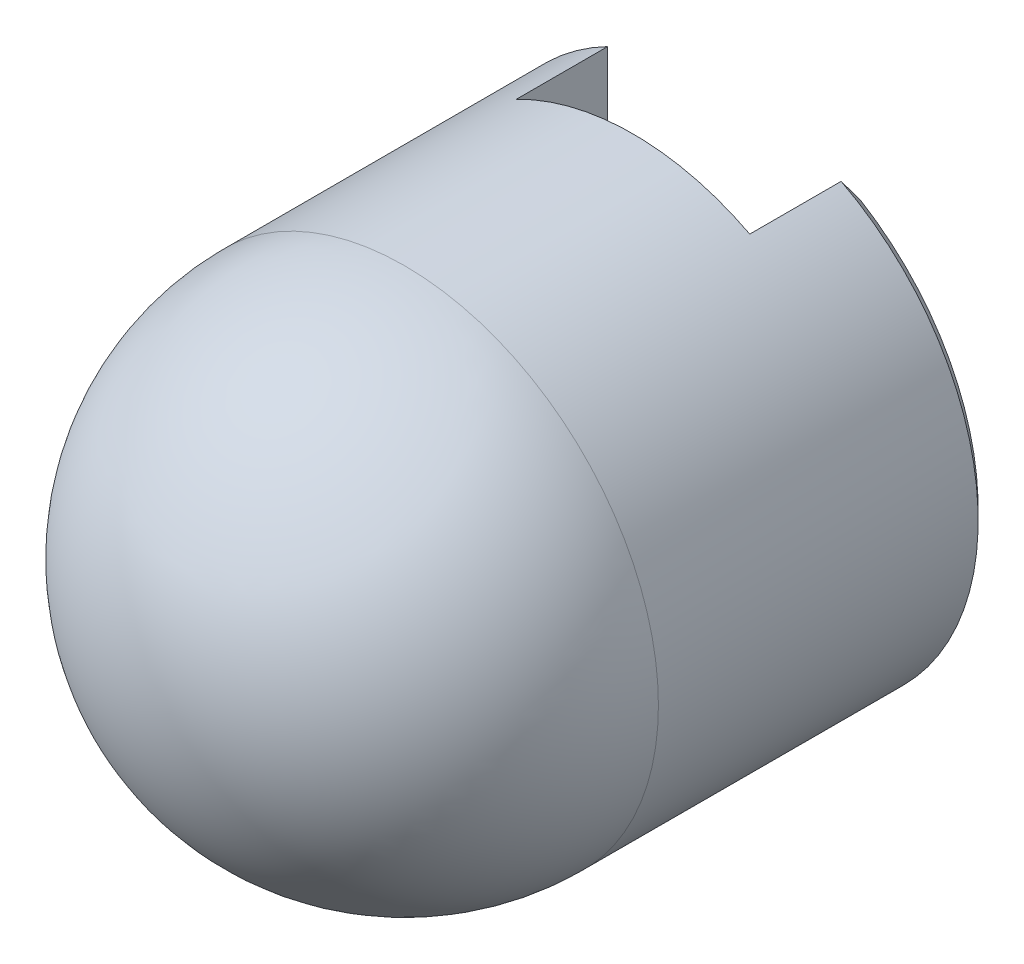
ISO-10303-21;
HEADER;
FILE_DESCRIPTION(('STEP AP214'),'2;1');
FILE_NAME('part.step','',(''),(''),'','','');
FILE_SCHEMA(('AUTOMOTIVE_DESIGN { 1 0 10303 214 1 1 1 1 }'));
ENDSEC;
DATA;
#1=APPLICATION_CONTEXT('core data for automotive mechanical design processes');
#2=APPLICATION_PROTOCOL_DEFINITION('international standard','automotive_design',2000,#1);
#3=PRODUCT_CONTEXT('',#1,'mechanical');
#4=PRODUCT('Part','Part','',(#3));
#5=PRODUCT_RELATED_PRODUCT_CATEGORY('part','',(#4));
#6=PRODUCT_DEFINITION_FORMATION('','',#4);
#7=PRODUCT_DEFINITION_CONTEXT('part definition',#1,'design');
#8=PRODUCT_DEFINITION('design','',#6,#7);
#9=PRODUCT_DEFINITION_SHAPE('','',#8);
#10=(LENGTH_UNIT() NAMED_UNIT(*) SI_UNIT(.MILLI.,.METRE.));
#11=(NAMED_UNIT(*) PLANE_ANGLE_UNIT() SI_UNIT($,.RADIAN.));
#12=(NAMED_UNIT(*) SI_UNIT($,.STERADIAN.) SOLID_ANGLE_UNIT());
#13=UNCERTAINTY_MEASURE_WITH_UNIT(LENGTH_MEASURE(1.E-05),#10,'distance_accuracy_value','');
#14=(GEOMETRIC_REPRESENTATION_CONTEXT(3) GLOBAL_UNCERTAINTY_ASSIGNED_CONTEXT((#13)) GLOBAL_UNIT_ASSIGNED_CONTEXT((#10,
#11,#12)) REPRESENTATION_CONTEXT('',''));
#15=CARTESIAN_POINT('',(0.,0.,0.));
#16=DIRECTION('',(0.,0.,1.));
#17=DIRECTION('',(1.,0.,0.));
#18=AXIS2_PLACEMENT_3D('',#15,#16,#17);
#19=CARTESIAN_POINT('',(0.,0.,0.));
#20=DIRECTION('',(0.,0.,1.));
#21=DIRECTION('',(1.,0.,0.));
#22=AXIS2_PLACEMENT_3D('',#19,#20,#21);
#23=PLANE('',#22);
#24=CARTESIAN_POINT('',(0.,0.,0.));
#25=DIRECTION('',(0.,0.,1.));
#26=DIRECTION('',(1.,0.,0.));
#27=AXIS2_PLACEMENT_3D('',#24,#25,#26);
#28=CIRCLE('',#27,4.8);
#29=CARTESIAN_POINT('',(2.5,4.09756024970957,0.));
#30=VERTEX_POINT('',#29);
#31=CARTESIAN_POINT('',(2.5,-4.09756024970957,0.));
#32=VERTEX_POINT('',#31);
#33=EDGE_CURVE('E131',#30,#32,#28,.F.);
#34=ORIENTED_EDGE('',*,*,#33,.T.);
#35=DIRECTION('',(0.,1.,0.));
#36=VECTOR('',#35,1.);
#37=CARTESIAN_POINT('',(2.5,0.,0.));
#38=LINE('',#37,#36);
#39=EDGE_CURVE('E133',#32,#30,#38,.T.);
#40=ORIENTED_EDGE('',*,*,#39,.T.);
#41=EDGE_LOOP('',(#34,#40));
#42=FACE_BOUND('',#41,.T.);
#43=ADVANCED_FACE('F33',(#42),#23,.F.);
#44=CARTESIAN_POINT('',(0.,0.,11.5));
#45=DIRECTION('',(0.,0.,-1.));
#46=DIRECTION('',(-1.,0.,0.));
#47=AXIS2_PLACEMENT_3D('',#44,#45,#46);
#48=CYLINDRICAL_SURFACE('',#47,5.);
#49=DIRECTION('',(0.,0.,-1.));
#50=VECTOR('',#49,1.);
#51=CARTESIAN_POINT('',(2.3,-4.43959457608462,11.5));
#52=LINE('',#51,#50);
#53=CARTESIAN_POINT('',(2.3,-4.43959457608462,2.));
#54=VERTEX_POINT('',#53);
#55=CARTESIAN_POINT('',(2.3,-4.43959457608462,0.199999999999999));
#56=VERTEX_POINT('',#55);
#57=EDGE_CURVE('E127',#54,#56,#52,.T.);
#58=ORIENTED_EDGE('',*,*,#57,.T.);
#59=CARTESIAN_POINT('',(0.,0.,0.199999999999999));
#60=DIRECTION('',(0.,0.,1.));
#61=DIRECTION('',(1.,0.,0.));
#62=AXIS2_PLACEMENT_3D('',#59,#60,#61);
#63=CIRCLE('',#62,5.);
#64=CARTESIAN_POINT('',(2.3,4.43959457608462,0.199999999999999));
#65=VERTEX_POINT('',#64);
#66=EDGE_CURVE('E140',#56,#65,#63,.T.);
#67=ORIENTED_EDGE('',*,*,#66,.T.);
#68=DIRECTION('',(0.,0.,-1.));
#69=VECTOR('',#68,1.);
#70=CARTESIAN_POINT('',(2.3,4.43959457608462,11.5));
#71=LINE('',#70,#69);
#72=CARTESIAN_POINT('',(2.3,4.43959457608462,2.));
#73=VERTEX_POINT('',#72);
#74=EDGE_CURVE('E125',#65,#73,#71,.F.);
#75=ORIENTED_EDGE('',*,*,#74,.T.);
#76=CARTESIAN_POINT('',(0.,0.,2.));
#77=DIRECTION('',(0.,0.,1.));
#78=DIRECTION('',(1.,0.,0.));
#79=AXIS2_PLACEMENT_3D('',#76,#77,#78);
#80=CIRCLE('',#79,5.);
#81=CARTESIAN_POINT('',(-2.3,4.43959457608462,2.));
#82=VERTEX_POINT('',#81);
#83=EDGE_CURVE('E116',#73,#82,#80,.T.);
#84=ORIENTED_EDGE('',*,*,#83,.T.);
#85=DIRECTION('',(0.,0.,-1.));
#86=VECTOR('',#85,1.);
#87=CARTESIAN_POINT('',(-2.3,4.43959457608462,11.5));
#88=LINE('',#87,#86);
#89=CARTESIAN_POINT('',(-2.3,4.43959457608462,0.199999999999999));
#90=VERTEX_POINT('',#89);
#91=EDGE_CURVE('E105',#82,#90,#88,.T.);
#92=ORIENTED_EDGE('',*,*,#91,.T.);
#93=CARTESIAN_POINT('',(0.,0.,0.199999999999999));
#94=DIRECTION('',(0.,0.,1.));
#95=DIRECTION('',(1.,0.,0.));
#96=AXIS2_PLACEMENT_3D('',#93,#94,#95);
#97=CIRCLE('',#96,5.);
#98=CARTESIAN_POINT('',(-2.3,-4.43959457608462,0.199999999999999));
#99=VERTEX_POINT('',#98);
#100=EDGE_CURVE('E102',#90,#99,#97,.T.);
#101=ORIENTED_EDGE('',*,*,#100,.T.);
#102=DIRECTION('',(0.,0.,-1.));
#103=VECTOR('',#102,1.);
#104=CARTESIAN_POINT('',(-2.3,-4.43959457608462,11.5));
#105=LINE('',#104,#103);
#106=CARTESIAN_POINT('',(-2.3,-4.43959457608462,2.));
#107=VERTEX_POINT('',#106);
#108=EDGE_CURVE('E94',#99,#107,#105,.F.);
#109=ORIENTED_EDGE('',*,*,#108,.T.);
#110=EDGE_CURVE('E99',#107,#54,#80,.T.);
#111=ORIENTED_EDGE('',*,*,#110,.T.);
#112=EDGE_LOOP('',(#58,#67,#75,#84,#92,#101,#109,#111));
#113=FACE_BOUND('',#112,.T.);
#114=CARTESIAN_POINT('',(0.,0.,6.5));
#115=DIRECTION('',(0.,0.,-1.));
#116=DIRECTION('',(-1.,0.,0.));
#117=AXIS2_PLACEMENT_3D('',#114,#115,#116);
#118=CIRCLE('',#117,5.);
#119=CARTESIAN_POINT('',(-5.,0.,6.5));
#120=VERTEX_POINT('',#119);
#121=EDGE_CURVE('E117',#120,#120,#118,.T.);
#122=ORIENTED_EDGE('',*,*,#121,.T.);
#123=EDGE_LOOP('',(#122));
#124=FACE_BOUND('',#123,.T.);
#125=ADVANCED_FACE('F97',(#113,#124),#48,.T.);
#126=CARTESIAN_POINT('',(0.,0.,0.));
#127=DIRECTION('',(0.,0.,1.));
#128=DIRECTION('',(1.,0.,0.));
#129=AXIS2_PLACEMENT_3D('',#126,#127,#128);
#130=CIRCLE('',#129,4.8);
#131=CARTESIAN_POINT('',(-2.5,-4.09756024970957,0.));
#132=VERTEX_POINT('',#131);
#133=CARTESIAN_POINT('',(-2.5,4.09756024970957,0.));
#134=VERTEX_POINT('',#133);
#135=EDGE_CURVE('E53',#132,#134,#130,.F.);
#136=ORIENTED_EDGE('',*,*,#135,.T.);
#137=DIRECTION('',(0.,-1.,0.));
#138=VECTOR('',#137,1.);
#139=CARTESIAN_POINT('',(-2.5,0.,0.));
#140=LINE('',#139,#138);
#141=EDGE_CURVE('E46',#134,#132,#140,.T.);
#142=ORIENTED_EDGE('',*,*,#141,.T.);
#143=EDGE_LOOP('',(#136,#142));
#144=FACE_BOUND('',#143,.T.);
#145=ADVANCED_FACE('F183',(#144),#23,.F.);
#146=CARTESIAN_POINT('',(0.,0.,6.5));
#147=DIRECTION('',(0.,0.,1.));
#148=DIRECTION('',(1.,0.,0.));
#149=AXIS2_PLACEMENT_3D('',#146,#147,#148);
#150=SPHERICAL_SURFACE('',#149,5.);
#151=ORIENTED_EDGE('',*,*,#121,.F.);
#152=EDGE_LOOP('',(#151));
#153=FACE_BOUND('',#152,.T.);
#154=ADVANCED_FACE('F191',(#153),#150,.T.);
#155=CARTESIAN_POINT('',(0.,0.,2.));
#156=DIRECTION('',(0.,0.,1.));
#157=DIRECTION('',(1.,0.,0.));
#158=AXIS2_PLACEMENT_3D('',#155,#156,#157);
#159=PLANE('',#158);
#160=DIRECTION('',(0.,-1.,0.));
#161=VECTOR('',#160,1.);
#162=CARTESIAN_POINT('',(2.3,7.5,2.));
#163=LINE('',#162,#161);
#164=EDGE_CURVE('E115',#73,#54,#163,.T.);
#165=ORIENTED_EDGE('',*,*,#164,.T.);
#166=ORIENTED_EDGE('',*,*,#110,.F.);
#167=DIRECTION('',(0.,1.,0.));
#168=VECTOR('',#167,1.);
#169=CARTESIAN_POINT('',(-2.3,7.5,2.));
#170=LINE('',#169,#168);
#171=EDGE_CURVE('E106',#107,#82,#170,.T.);
#172=ORIENTED_EDGE('',*,*,#171,.T.);
#173=ORIENTED_EDGE('',*,*,#83,.F.);
#174=EDGE_LOOP('',(#165,#166,#172,#173));
#175=FACE_BOUND('',#174,.T.);
#176=ADVANCED_FACE('F111',(#175),#159,.F.);
#177=CARTESIAN_POINT('',(2.3,7.5,2.));
#178=DIRECTION('',(1.,0.,0.));
#179=DIRECTION('',(0.,1.,0.));
#180=AXIS2_PLACEMENT_3D('',#177,#178,#179);
#181=PLANE('',#180);
#182=ORIENTED_EDGE('',*,*,#74,.F.);
#183=DIRECTION('',(0.,-1.,0.));
#184=VECTOR('',#183,1.);
#185=CARTESIAN_POINT('',(2.3,7.5,0.2));
#186=LINE('',#185,#184);
#187=EDGE_CURVE('E136',#65,#56,#186,.T.);
#188=ORIENTED_EDGE('',*,*,#187,.T.);
#189=ORIENTED_EDGE('',*,*,#57,.F.);
#190=ORIENTED_EDGE('',*,*,#164,.F.);
#191=EDGE_LOOP('',(#182,#188,#189,#190));
#192=FACE_BOUND('',#191,.T.);
#193=ADVANCED_FACE('F172',(#192),#181,.F.);
#194=CARTESIAN_POINT('',(-2.3,7.5,2.));
#195=DIRECTION('',(-1.,0.,0.));
#196=DIRECTION('',(0.,-1.,0.));
#197=AXIS2_PLACEMENT_3D('',#194,#195,#196);
#198=PLANE('',#197);
#199=ORIENTED_EDGE('',*,*,#108,.F.);
#200=DIRECTION('',(0.,1.,0.));
#201=VECTOR('',#200,1.);
#202=CARTESIAN_POINT('',(-2.3,7.5,0.2));
#203=LINE('',#202,#201);
#204=EDGE_CURVE('E11',#99,#90,#203,.T.);
#205=ORIENTED_EDGE('',*,*,#204,.T.);
#206=ORIENTED_EDGE('',*,*,#91,.F.);
#207=ORIENTED_EDGE('',*,*,#171,.F.);
#208=EDGE_LOOP('',(#199,#205,#206,#207));
#209=FACE_BOUND('',#208,.T.);
#210=ADVANCED_FACE('F119',(#209),#198,.F.);
#211=CARTESIAN_POINT('',(0.,0.,0.199999999999999));
#212=DIRECTION('',(0.,0.,1.));
#213=DIRECTION('',(1.,0.,0.));
#214=AXIS2_PLACEMENT_3D('',#211,#212,#213);
#215=CONICAL_SURFACE('',#214,5.,0.785398163397455);
#216=CARTESIAN_POINT('',(2.5,4.09756024970957,0.));
#217=CARTESIAN_POINT('',(2.46745966462633,4.15549355038893,0.0325403353736728));
#218=CARTESIAN_POINT('',(2.43452279655675,4.21296311666385,0.0654772034432477));
#219=CARTESIAN_POINT('',(2.36785612675598,4.32697455512361,0.132143873244021));
#220=CARTESIAN_POINT('',(2.33412632815889,4.38351643097371,0.165873671841113));
#221=CARTESIAN_POINT('',(2.3,4.43959457608462,0.199999999999999));
#222=B_SPLINE_CURVE_WITH_KNOTS('',3,(#216,#217,#218,#219,#220,#221),.UNSPECIFIED.,.F.,.F.,(4,2,
4),(0.,0.221927534205724,0.443854191376594),.UNSPECIFIED.);
#223=EDGE_CURVE('E144',#65,#30,#222,.F.);
#224=ORIENTED_EDGE('',*,*,#223,.F.);
#225=ORIENTED_EDGE('',*,*,#66,.F.);
#226=CARTESIAN_POINT('',(2.3,-4.43959457608462,0.199999999999999));
#227=CARTESIAN_POINT('',(2.33412632815889,-4.38351643097371,0.165873671841112));
#228=CARTESIAN_POINT('',(2.36785612675598,-4.32697455512361,0.132143873244021));
#229=CARTESIAN_POINT('',(2.43452279655675,-4.21296311666385,0.0654772034432475));
#230=CARTESIAN_POINT('',(2.46745966462633,-4.15549355038893,0.0325403353736726));
#231=CARTESIAN_POINT('',(2.5,-4.09756024970957,0.));
#232=B_SPLINE_CURVE_WITH_KNOTS('',3,(#226,#227,#228,#229,#230,#231),.UNSPECIFIED.,.F.,.F.,(4,2,
4),(0.,0.22192665717087,0.443854191376593),.UNSPECIFIED.);
#233=EDGE_CURVE('E121',#32,#56,#232,.F.);
#234=ORIENTED_EDGE('',*,*,#233,.F.);
#235=ORIENTED_EDGE('',*,*,#33,.F.);
#236=EDGE_LOOP('',(#224,#225,#234,#235));
#237=FACE_BOUND('',#236,.T.);
#238=ADVANCED_FACE('F154',(#237),#215,.T.);
#239=CARTESIAN_POINT('',(2.5,0.,0.));
#240=DIRECTION('',(0.707106781186544,0.,0.707106781186551));
#241=DIRECTION('',(0.,1.,0.));
#242=AXIS2_PLACEMENT_3D('',#239,#240,#241);
#243=PLANE('',#242);
#244=ORIENTED_EDGE('',*,*,#233,.T.);
#245=ORIENTED_EDGE('',*,*,#187,.F.);
#246=ORIENTED_EDGE('',*,*,#223,.T.);
#247=ORIENTED_EDGE('',*,*,#39,.F.);
#248=EDGE_LOOP('',(#244,#245,#246,#247));
#249=FACE_BOUND('',#248,.T.);
#250=ADVANCED_FACE('F157',(#249),#243,.F.);
#251=CARTESIAN_POINT('',(0.,0.,0.199999999999999));
#252=DIRECTION('',(0.,0.,1.));
#253=DIRECTION('',(1.,0.,0.));
#254=AXIS2_PLACEMENT_3D('',#251,#252,#253);
#255=CONICAL_SURFACE('',#254,5.,0.785398163397455);
#256=CARTESIAN_POINT('',(-2.5,-4.09756024970957,0.));
#257=CARTESIAN_POINT('',(-2.46745966462633,-4.15549355038893,0.0325403353736728));
#258=CARTESIAN_POINT('',(-2.43452279655675,-4.21296311666385,0.0654772034432477));
#259=CARTESIAN_POINT('',(-2.36785612675598,-4.32697455512361,0.132143873244021));
#260=CARTESIAN_POINT('',(-2.33412632815889,-4.38351643097371,0.165873671841113));
#261=CARTESIAN_POINT('',(-2.3,-4.43959457608462,0.199999999999999));
#262=B_SPLINE_CURVE_WITH_KNOTS('',3,(#256,#257,#258,#259,#260,#261),.UNSPECIFIED.,.F.,.F.,(4,2,
4),(0.,0.221927534205724,0.443854191376594),.UNSPECIFIED.);
#263=EDGE_CURVE('E61',#99,#132,#262,.F.);
#264=ORIENTED_EDGE('',*,*,#263,.F.);
#265=ORIENTED_EDGE('',*,*,#100,.F.);
#266=CARTESIAN_POINT('',(-2.3,4.43959457608462,0.199999999999999));
#267=CARTESIAN_POINT('',(-2.33412632815889,4.38351643097371,0.165873671841112));
#268=CARTESIAN_POINT('',(-2.36785612675598,4.32697455512361,0.132143873244021));
#269=CARTESIAN_POINT('',(-2.43452279655675,4.21296311666385,0.0654772034432475));
#270=CARTESIAN_POINT('',(-2.46745966462633,4.15549355038893,0.0325403353736726));
#271=CARTESIAN_POINT('',(-2.5,4.09756024970957,0.));
#272=B_SPLINE_CURVE_WITH_KNOTS('',3,(#266,#267,#268,#269,#270,#271),.UNSPECIFIED.,.F.,.F.,(4,2,
4),(0.,0.22192665717087,0.443854191376593),.UNSPECIFIED.);
#273=EDGE_CURVE('E38',#134,#90,#272,.F.);
#274=ORIENTED_EDGE('',*,*,#273,.F.);
#275=ORIENTED_EDGE('',*,*,#135,.F.);
#276=EDGE_LOOP('',(#264,#265,#274,#275));
#277=FACE_BOUND('',#276,.T.);
#278=ADVANCED_FACE('F160',(#277),#255,.T.);
#279=CARTESIAN_POINT('',(-2.5,0.,0.));
#280=DIRECTION('',(-0.707106781186544,0.,0.707106781186551));
#281=DIRECTION('',(0.,-1.,0.));
#282=AXIS2_PLACEMENT_3D('',#279,#280,#281);
#283=PLANE('',#282);
#284=ORIENTED_EDGE('',*,*,#273,.T.);
#285=ORIENTED_EDGE('',*,*,#204,.F.);
#286=ORIENTED_EDGE('',*,*,#263,.T.);
#287=ORIENTED_EDGE('',*,*,#141,.F.);
#288=EDGE_LOOP('',(#284,#285,#286,#287));
#289=FACE_BOUND('',#288,.T.);
#290=ADVANCED_FACE('F35',(#289),#283,.F.);
#291=CLOSED_SHELL('',(#43,#125,#145,#154,#176,#193,#210,#238,#250,#278,#290));
#292=MANIFOLD_SOLID_BREP('B2',#291);
#293=ADVANCED_BREP_SHAPE_REPRESENTATION('',(#18,#292),#14);
#294=SHAPE_DEFINITION_REPRESENTATION(#9,#293);
ENDSEC;
END-ISO-10303-21;
